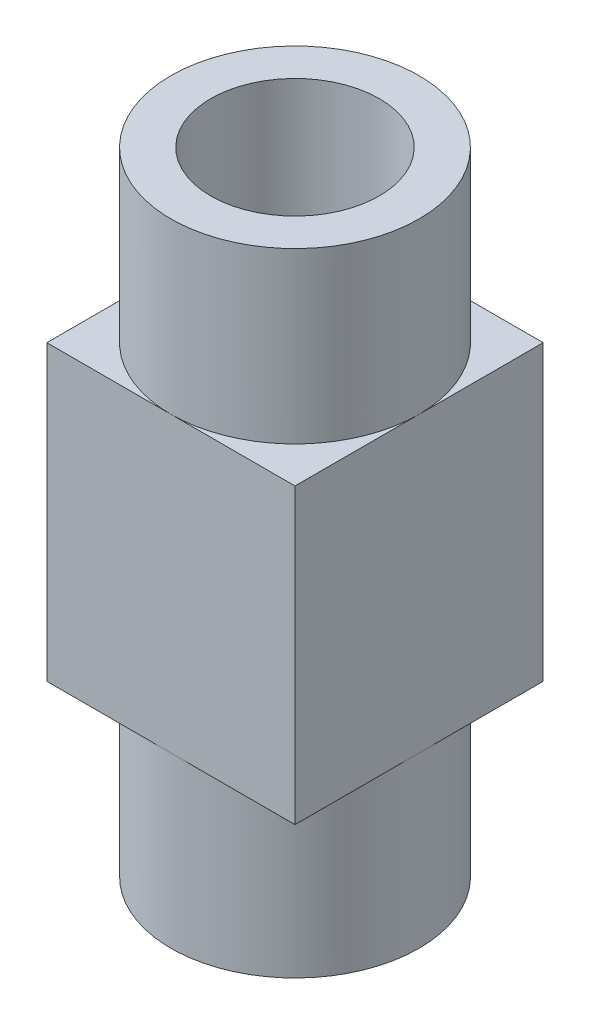
ISO-10303-21;
HEADER;
FILE_DESCRIPTION(('STEP AP214'),'2;1');
FILE_NAME('part.step','',(''),(''),'','','');
FILE_SCHEMA(('AUTOMOTIVE_DESIGN { 1 0 10303 214 1 1 1 1 }'));
ENDSEC;
DATA;
#1=APPLICATION_CONTEXT('core data for automotive mechanical design processes');
#2=APPLICATION_PROTOCOL_DEFINITION('international standard','automotive_design',2000,#1);
#3=PRODUCT_CONTEXT('',#1,'mechanical');
#4=PRODUCT('Part','Part','',(#3));
#5=PRODUCT_RELATED_PRODUCT_CATEGORY('part','',(#4));
#6=PRODUCT_DEFINITION_FORMATION('','',#4);
#7=PRODUCT_DEFINITION_CONTEXT('part definition',#1,'design');
#8=PRODUCT_DEFINITION('design','',#6,#7);
#9=PRODUCT_DEFINITION_SHAPE('','',#8);
#10=(LENGTH_UNIT() NAMED_UNIT(*) SI_UNIT(.MILLI.,.METRE.));
#11=(NAMED_UNIT(*) PLANE_ANGLE_UNIT() SI_UNIT($,.RADIAN.));
#12=(NAMED_UNIT(*) SI_UNIT($,.STERADIAN.) SOLID_ANGLE_UNIT());
#13=UNCERTAINTY_MEASURE_WITH_UNIT(LENGTH_MEASURE(1.E-05),#10,'distance_accuracy_value','');
#14=(GEOMETRIC_REPRESENTATION_CONTEXT(3) GLOBAL_UNCERTAINTY_ASSIGNED_CONTEXT((#13)) GLOBAL_UNIT_ASSIGNED_CONTEXT((#10,
#11,#12)) REPRESENTATION_CONTEXT('',''));
#15=CARTESIAN_POINT('',(0.,0.,0.));
#16=DIRECTION('',(0.,0.,1.));
#17=DIRECTION('',(1.,0.,0.));
#18=AXIS2_PLACEMENT_3D('',#15,#16,#17);
#19=CARTESIAN_POINT('',(-11.,41.,-11.));
#20=DIRECTION('',(0.,1.,0.));
#21=DIRECTION('',(0.,0.,1.));
#22=AXIS2_PLACEMENT_3D('',#19,#20,#21);
#23=PLANE('',#22);
#24=DIRECTION('',(0.,0.,-1.));
#25=VECTOR('',#24,1.);
#26=CARTESIAN_POINT('',(11.,41.,11.));
#27=LINE('',#26,#25);
#28=CARTESIAN_POINT('',(11.,41.,11.));
#29=VERTEX_POINT('',#28);
#30=CARTESIAN_POINT('',(11.,41.,0.));
#31=VERTEX_POINT('',#30);
#32=EDGE_CURVE('E140',#29,#31,#27,.T.);
#33=ORIENTED_EDGE('',*,*,#32,.T.);
#34=CARTESIAN_POINT('',(0.,41.,0.));
#35=DIRECTION('',(0.,-1.,0.));
#36=DIRECTION('',(1.,0.,0.));
#37=AXIS2_PLACEMENT_3D('',#34,#35,#36);
#38=CIRCLE('',#37,11.);
#39=CARTESIAN_POINT('',(0.,41.,11.));
#40=VERTEX_POINT('',#39);
#41=EDGE_CURVE('E76',#31,#40,#38,.T.);
#42=ORIENTED_EDGE('',*,*,#41,.T.);
#43=DIRECTION('',(1.,0.,0.));
#44=VECTOR('',#43,1.);
#45=CARTESIAN_POINT('',(-11.,41.,11.));
#46=LINE('',#45,#44);
#47=EDGE_CURVE('E137',#40,#29,#46,.T.);
#48=ORIENTED_EDGE('',*,*,#47,.T.);
#49=EDGE_LOOP('',(#33,#42,#48));
#50=FACE_BOUND('',#49,.T.);
#51=ADVANCED_FACE('F64',(#50),#23,.T.);
#52=CARTESIAN_POINT('',(-11.,41.,11.));
#53=VERTEX_POINT('',#52);
#54=EDGE_CURVE('E149',#53,#40,#46,.T.);
#55=ORIENTED_EDGE('',*,*,#54,.T.);
#56=CARTESIAN_POINT('',(-11.,41.,0.));
#57=VERTEX_POINT('',#56);
#58=EDGE_CURVE('E11',#40,#57,#38,.T.);
#59=ORIENTED_EDGE('',*,*,#58,.T.);
#60=DIRECTION('',(0.,0.,1.));
#61=VECTOR('',#60,1.);
#62=CARTESIAN_POINT('',(-11.,41.,-11.));
#63=LINE('',#62,#61);
#64=EDGE_CURVE('E154',#57,#53,#63,.T.);
#65=ORIENTED_EDGE('',*,*,#64,.T.);
#66=EDGE_LOOP('',(#55,#59,#65));
#67=FACE_BOUND('',#66,.T.);
#68=ADVANCED_FACE('F153',(#67),#23,.T.);
#69=CARTESIAN_POINT('',(-11.,41.,-11.));
#70=VERTEX_POINT('',#69);
#71=EDGE_CURVE('E151',#70,#57,#63,.T.);
#72=ORIENTED_EDGE('',*,*,#71,.T.);
#73=CARTESIAN_POINT('',(0.,41.,-11.));
#74=VERTEX_POINT('',#73);
#75=EDGE_CURVE('E74',#57,#74,#38,.T.);
#76=ORIENTED_EDGE('',*,*,#75,.T.);
#77=DIRECTION('',(-1.,0.,0.));
#78=VECTOR('',#77,1.);
#79=CARTESIAN_POINT('',(11.,41.,-11.));
#80=LINE('',#79,#78);
#81=EDGE_CURVE('E160',#74,#70,#80,.T.);
#82=ORIENTED_EDGE('',*,*,#81,.T.);
#83=EDGE_LOOP('',(#72,#76,#82));
#84=FACE_BOUND('',#83,.T.);
#85=ADVANCED_FACE('F217',(#84),#23,.T.);
#86=CARTESIAN_POINT('',(11.,41.,-11.));
#87=VERTEX_POINT('',#86);
#88=EDGE_CURVE('E161',#87,#74,#80,.T.);
#89=ORIENTED_EDGE('',*,*,#88,.T.);
#90=EDGE_CURVE('E144',#74,#31,#38,.T.);
#91=ORIENTED_EDGE('',*,*,#90,.T.);
#92=EDGE_CURVE('E156',#31,#87,#27,.T.);
#93=ORIENTED_EDGE('',*,*,#92,.T.);
#94=EDGE_LOOP('',(#89,#91,#93));
#95=FACE_BOUND('',#94,.T.);
#96=ADVANCED_FACE('F209',(#95),#23,.T.);
#97=CARTESIAN_POINT('',(0.,15.,0.));
#98=DIRECTION('',(0.,-1.,0.));
#99=DIRECTION('',(0.,0.,-1.));
#100=AXIS2_PLACEMENT_3D('',#97,#98,#99);
#101=CYLINDRICAL_SURFACE('',#100,11.);
#102=CARTESIAN_POINT('',(0.,15.,0.));
#103=DIRECTION('',(0.,-1.,0.));
#104=DIRECTION('',(1.,0.,0.));
#105=AXIS2_PLACEMENT_3D('',#102,#103,#104);
#106=CIRCLE('',#105,11.);
#107=CARTESIAN_POINT('',(11.,15.,0.));
#108=VERTEX_POINT('',#107);
#109=CARTESIAN_POINT('',(0.,15.,11.));
#110=VERTEX_POINT('',#109);
#111=EDGE_CURVE('E190',#108,#110,#106,.T.);
#112=ORIENTED_EDGE('',*,*,#111,.T.);
#113=CARTESIAN_POINT('',(-11.,15.,0.));
#114=VERTEX_POINT('',#113);
#115=EDGE_CURVE('E192',#110,#114,#106,.T.);
#116=ORIENTED_EDGE('',*,*,#115,.T.);
#117=CARTESIAN_POINT('',(0.,15.,-11.));
#118=VERTEX_POINT('',#117);
#119=EDGE_CURVE('E199',#114,#118,#106,.T.);
#120=ORIENTED_EDGE('',*,*,#119,.T.);
#121=EDGE_CURVE('E193',#118,#108,#106,.T.);
#122=ORIENTED_EDGE('',*,*,#121,.T.);
#123=EDGE_LOOP('',(#112,#116,#120,#122));
#124=FACE_BOUND('',#123,.T.);
#125=CARTESIAN_POINT('',(0.,0.,0.));
#126=DIRECTION('',(0.,-1.,0.));
#127=DIRECTION('',(1.,0.,0.));
#128=AXIS2_PLACEMENT_3D('',#125,#126,#127);
#129=CIRCLE('',#128,11.);
#130=CARTESIAN_POINT('',(11.,0.,0.));
#131=VERTEX_POINT('',#130);
#132=EDGE_CURVE('E68',#131,#131,#129,.T.);
#133=ORIENTED_EDGE('',*,*,#132,.F.);
#134=EDGE_LOOP('',(#133));
#135=FACE_BOUND('',#134,.T.);
#136=ADVANCED_FACE('F66',(#124,#135),#101,.T.);
#137=CARTESIAN_POINT('',(0.,0.,0.));
#138=DIRECTION('',(0.,-1.,0.));
#139=DIRECTION('',(0.,0.,-1.));
#140=AXIS2_PLACEMENT_3D('',#137,#138,#139);
#141=PLANE('',#140);
#142=CARTESIAN_POINT('',(0.,0.,0.));
#143=DIRECTION('',(0.,1.,0.));
#144=DIRECTION('',(0.,0.,-1.));
#145=AXIS2_PLACEMENT_3D('',#142,#143,#144);
#146=CIRCLE('',#145,7.475);
#147=CARTESIAN_POINT('',(0.,0.,-7.475));
#148=VERTEX_POINT('',#147);
#149=EDGE_CURVE('E281',#148,#148,#146,.T.);
#150=ORIENTED_EDGE('',*,*,#149,.T.);
#151=EDGE_LOOP('',(#150));
#152=FACE_BOUND('',#151,.T.);
#153=ORIENTED_EDGE('',*,*,#132,.T.);
#154=EDGE_LOOP('',(#153));
#155=FACE_BOUND('',#154,.T.);
#156=ADVANCED_FACE('F206',(#152,#155),#141,.T.);
#157=CARTESIAN_POINT('',(-11.,15.,-11.));
#158=DIRECTION('',(0.,1.,0.));
#159=DIRECTION('',(0.,0.,1.));
#160=AXIS2_PLACEMENT_3D('',#157,#158,#159);
#161=PLANE('',#160);
#162=ORIENTED_EDGE('',*,*,#111,.F.);
#163=DIRECTION('',(0.,0.,-1.));
#164=VECTOR('',#163,1.);
#165=CARTESIAN_POINT('',(11.,15.,0.));
#166=LINE('',#165,#164);
#167=CARTESIAN_POINT('',(11.,15.,11.));
#168=VERTEX_POINT('',#167);
#169=EDGE_CURVE('E90',#168,#108,#166,.T.);
#170=ORIENTED_EDGE('',*,*,#169,.F.);
#171=DIRECTION('',(1.,0.,0.));
#172=VECTOR('',#171,1.);
#173=CARTESIAN_POINT('',(0.,15.,11.));
#174=LINE('',#173,#172);
#175=EDGE_CURVE('E169',#110,#168,#174,.T.);
#176=ORIENTED_EDGE('',*,*,#175,.F.);
#177=EDGE_LOOP('',(#162,#170,#176));
#178=FACE_BOUND('',#177,.T.);
#179=ADVANCED_FACE('F214',(#178),#161,.F.);
#180=ORIENTED_EDGE('',*,*,#115,.F.);
#181=CARTESIAN_POINT('',(-11.,15.,11.));
#182=VERTEX_POINT('',#181);
#183=EDGE_CURVE('E171',#182,#110,#174,.T.);
#184=ORIENTED_EDGE('',*,*,#183,.F.);
#185=DIRECTION('',(0.,0.,1.));
#186=VECTOR('',#185,1.);
#187=CARTESIAN_POINT('',(-11.,15.,0.));
#188=LINE('',#187,#186);
#189=EDGE_CURVE('E170',#114,#182,#188,.T.);
#190=ORIENTED_EDGE('',*,*,#189,.F.);
#191=EDGE_LOOP('',(#180,#184,#190));
#192=FACE_BOUND('',#191,.T.);
#193=ADVANCED_FACE('F247',(#192),#161,.F.);
#194=ORIENTED_EDGE('',*,*,#119,.F.);
#195=CARTESIAN_POINT('',(-11.,15.,-11.));
#196=VERTEX_POINT('',#195);
#197=EDGE_CURVE('E165',#196,#114,#188,.T.);
#198=ORIENTED_EDGE('',*,*,#197,.F.);
#199=DIRECTION('',(-1.,0.,0.));
#200=VECTOR('',#199,1.);
#201=CARTESIAN_POINT('',(11.,15.,-11.));
#202=LINE('',#201,#200);
#203=EDGE_CURVE('E178',#118,#196,#202,.T.);
#204=ORIENTED_EDGE('',*,*,#203,.F.);
#205=EDGE_LOOP('',(#194,#198,#204));
#206=FACE_BOUND('',#205,.T.);
#207=ADVANCED_FACE('F232',(#206),#161,.F.);
#208=CARTESIAN_POINT('',(-11.,41.,0.));
#209=DIRECTION('',(1.,0.,0.));
#210=DIRECTION('',(0.,0.,-1.));
#211=AXIS2_PLACEMENT_3D('',#208,#209,#210);
#212=PLANE('',#211);
#213=ORIENTED_EDGE('',*,*,#197,.T.);
#214=ORIENTED_EDGE('',*,*,#189,.T.);
#215=DIRECTION('',(0.,-1.,0.));
#216=VECTOR('',#215,1.);
#217=CARTESIAN_POINT('',(-11.,41.,11.));
#218=LINE('',#217,#216);
#219=EDGE_CURVE('E186',#53,#182,#218,.T.);
#220=ORIENTED_EDGE('',*,*,#219,.F.);
#221=ORIENTED_EDGE('',*,*,#64,.F.);
#222=ORIENTED_EDGE('',*,*,#71,.F.);
#223=DIRECTION('',(0.,-1.,0.));
#224=VECTOR('',#223,1.);
#225=CARTESIAN_POINT('',(-11.,41.,-11.));
#226=LINE('',#225,#224);
#227=EDGE_CURVE('E188',#70,#196,#226,.T.);
#228=ORIENTED_EDGE('',*,*,#227,.T.);
#229=EDGE_LOOP('',(#213,#214,#220,#221,#222,#228));
#230=FACE_BOUND('',#229,.T.);
#231=ADVANCED_FACE('F241',(#230),#212,.F.);
#232=CARTESIAN_POINT('',(0.,41.,11.));
#233=DIRECTION('',(0.,0.,-1.));
#234=DIRECTION('',(-1.,0.,0.));
#235=AXIS2_PLACEMENT_3D('',#232,#233,#234);
#236=PLANE('',#235);
#237=ORIENTED_EDGE('',*,*,#175,.T.);
#238=DIRECTION('',(0.,-1.,0.));
#239=VECTOR('',#238,1.);
#240=CARTESIAN_POINT('',(11.,41.,11.));
#241=LINE('',#240,#239);
#242=EDGE_CURVE('E150',#29,#168,#241,.T.);
#243=ORIENTED_EDGE('',*,*,#242,.F.);
#244=ORIENTED_EDGE('',*,*,#47,.F.);
#245=ORIENTED_EDGE('',*,*,#54,.F.);
#246=ORIENTED_EDGE('',*,*,#219,.T.);
#247=ORIENTED_EDGE('',*,*,#183,.T.);
#248=EDGE_LOOP('',(#237,#243,#244,#245,#246,#247));
#249=FACE_BOUND('',#248,.T.);
#250=ADVANCED_FACE('F148',(#249),#236,.F.);
#251=CARTESIAN_POINT('',(11.,41.,0.));
#252=DIRECTION('',(-1.,0.,0.));
#253=DIRECTION('',(0.,0.,1.));
#254=AXIS2_PLACEMENT_3D('',#251,#252,#253);
#255=PLANE('',#254);
#256=ORIENTED_EDGE('',*,*,#169,.T.);
#257=CARTESIAN_POINT('',(11.,15.,-11.));
#258=VERTEX_POINT('',#257);
#259=EDGE_CURVE('E175',#108,#258,#166,.T.);
#260=ORIENTED_EDGE('',*,*,#259,.T.);
#261=DIRECTION('',(0.,-1.,0.));
#262=VECTOR('',#261,1.);
#263=CARTESIAN_POINT('',(11.,41.,-11.));
#264=LINE('',#263,#262);
#265=EDGE_CURVE('E164',#87,#258,#264,.T.);
#266=ORIENTED_EDGE('',*,*,#265,.F.);
#267=ORIENTED_EDGE('',*,*,#92,.F.);
#268=ORIENTED_EDGE('',*,*,#32,.F.);
#269=ORIENTED_EDGE('',*,*,#242,.T.);
#270=EDGE_LOOP('',(#256,#260,#266,#267,#268,#269));
#271=FACE_BOUND('',#270,.T.);
#272=ADVANCED_FACE('F235',(#271),#255,.F.);
#273=CARTESIAN_POINT('',(11.,41.,-11.));
#274=DIRECTION('',(0.,0.,1.));
#275=DIRECTION('',(1.,0.,0.));
#276=AXIS2_PLACEMENT_3D('',#273,#274,#275);
#277=PLANE('',#276);
#278=EDGE_CURVE('E179',#258,#118,#202,.T.);
#279=ORIENTED_EDGE('',*,*,#278,.T.);
#280=ORIENTED_EDGE('',*,*,#203,.T.);
#281=ORIENTED_EDGE('',*,*,#227,.F.);
#282=ORIENTED_EDGE('',*,*,#81,.F.);
#283=ORIENTED_EDGE('',*,*,#88,.F.);
#284=ORIENTED_EDGE('',*,*,#265,.T.);
#285=EDGE_LOOP('',(#279,#280,#281,#282,#283,#284));
#286=FACE_BOUND('',#285,.T.);
#287=ADVANCED_FACE('F230',(#286),#277,.F.);
#288=ORIENTED_EDGE('',*,*,#121,.F.);
#289=ORIENTED_EDGE('',*,*,#278,.F.);
#290=ORIENTED_EDGE('',*,*,#259,.F.);
#291=EDGE_LOOP('',(#288,#289,#290));
#292=FACE_BOUND('',#291,.T.);
#293=ADVANCED_FACE('F227',(#292),#161,.F.);
#294=CARTESIAN_POINT('',(0.,56.,0.));
#295=DIRECTION('',(0.,-1.,0.));
#296=DIRECTION('',(0.,0.,-1.));
#297=AXIS2_PLACEMENT_3D('',#294,#295,#296);
#298=CYLINDRICAL_SURFACE('',#297,11.);
#299=CARTESIAN_POINT('',(0.,56.,0.));
#300=DIRECTION('',(0.,-1.,0.));
#301=DIRECTION('',(-1.,0.,0.));
#302=AXIS2_PLACEMENT_3D('',#299,#300,#301);
#303=CIRCLE('',#302,11.);
#304=CARTESIAN_POINT('',(-11.,56.,0.));
#305=VERTEX_POINT('',#304);
#306=EDGE_CURVE('E142',#305,#305,#303,.T.);
#307=ORIENTED_EDGE('',*,*,#306,.T.);
#308=EDGE_LOOP('',(#307));
#309=FACE_BOUND('',#308,.T.);
#310=ORIENTED_EDGE('',*,*,#41,.F.);
#311=ORIENTED_EDGE('',*,*,#90,.F.);
#312=ORIENTED_EDGE('',*,*,#75,.F.);
#313=ORIENTED_EDGE('',*,*,#58,.F.);
#314=EDGE_LOOP('',(#310,#311,#312,#313));
#315=FACE_BOUND('',#314,.T.);
#316=ADVANCED_FACE('F129',(#309,#315),#298,.T.);
#317=CARTESIAN_POINT('',(0.,56.,0.));
#318=DIRECTION('',(0.,-1.,0.));
#319=DIRECTION('',(0.,0.,-1.));
#320=AXIS2_PLACEMENT_3D('',#317,#318,#319);
#321=PLANE('',#320);
#322=CARTESIAN_POINT('',(0.,56.,0.));
#323=DIRECTION('',(0.,-1.,0.));
#324=DIRECTION('',(0.,0.,1.));
#325=AXIS2_PLACEMENT_3D('',#322,#323,#324);
#326=CIRCLE('',#325,7.475);
#327=CARTESIAN_POINT('',(0.,56.,7.475));
#328=VERTEX_POINT('',#327);
#329=EDGE_CURVE('E287',#328,#328,#326,.T.);
#330=ORIENTED_EDGE('',*,*,#329,.T.);
#331=EDGE_LOOP('',(#330));
#332=FACE_BOUND('',#331,.T.);
#333=ORIENTED_EDGE('',*,*,#306,.F.);
#334=EDGE_LOOP('',(#333));
#335=FACE_BOUND('',#334,.T.);
#336=ADVANCED_FACE('F291',(#332,#335),#321,.F.);
#337=CARTESIAN_POINT('',(0.,15.,0.));
#338=DIRECTION('',(0.,1.,0.));
#339=DIRECTION('',(0.,0.,1.));
#340=AXIS2_PLACEMENT_3D('',#337,#338,#339);
#341=PLANE('',#340);
#342=CARTESIAN_POINT('',(0.,15.,0.));
#343=DIRECTION('',(0.,-1.,0.));
#344=DIRECTION('',(0.,0.,-1.));
#345=AXIS2_PLACEMENT_3D('',#342,#343,#344);
#346=CIRCLE('',#345,7.475);
#347=CARTESIAN_POINT('',(0.,15.,-7.475));
#348=VERTEX_POINT('',#347);
#349=EDGE_CURVE('E143',#348,#348,#346,.T.);
#350=ORIENTED_EDGE('',*,*,#349,.T.);
#351=EDGE_LOOP('',(#350));
#352=FACE_BOUND('',#351,.T.);
#353=ADVANCED_FACE('F307',(#352),#341,.F.);
#354=CARTESIAN_POINT('',(0.,0.,0.));
#355=DIRECTION('',(0.,1.,0.));
#356=DIRECTION('',(0.,0.,-1.));
#357=AXIS2_PLACEMENT_3D('',#354,#355,#356);
#358=CYLINDRICAL_SURFACE('',#357,7.475);
#359=ORIENTED_EDGE('',*,*,#349,.F.);
#360=EDGE_LOOP('',(#359));
#361=FACE_BOUND('',#360,.T.);
#362=ORIENTED_EDGE('',*,*,#149,.F.);
#363=EDGE_LOOP('',(#362));
#364=FACE_BOUND('',#363,.T.);
#365=ADVANCED_FACE('F302',(#361,#364),#358,.F.);
#366=CARTESIAN_POINT('',(0.,41.,0.));
#367=DIRECTION('',(0.,-1.,0.));
#368=DIRECTION('',(0.,0.,-1.));
#369=AXIS2_PLACEMENT_3D('',#366,#367,#368);
#370=PLANE('',#369);
#371=CARTESIAN_POINT('',(0.,41.,0.));
#372=DIRECTION('',(0.,1.,0.));
#373=DIRECTION('',(0.,0.,1.));
#374=AXIS2_PLACEMENT_3D('',#371,#372,#373);
#375=CIRCLE('',#374,7.475);
#376=CARTESIAN_POINT('',(0.,41.,7.475));
#377=VERTEX_POINT('',#376);
#378=EDGE_CURVE('E284',#377,#377,#375,.T.);
#379=ORIENTED_EDGE('',*,*,#378,.T.);
#380=EDGE_LOOP('',(#379));
#381=FACE_BOUND('',#380,.T.);
#382=ADVANCED_FACE('F296',(#381),#370,.F.);
#383=CARTESIAN_POINT('',(0.,56.,0.));
#384=DIRECTION('',(0.,-1.,0.));
#385=DIRECTION('',(0.,0.,1.));
#386=AXIS2_PLACEMENT_3D('',#383,#384,#385);
#387=CYLINDRICAL_SURFACE('',#386,7.475);
#388=ORIENTED_EDGE('',*,*,#378,.F.);
#389=EDGE_LOOP('',(#388));
#390=FACE_BOUND('',#389,.T.);
#391=ORIENTED_EDGE('',*,*,#329,.F.);
#392=EDGE_LOOP('',(#391));
#393=FACE_BOUND('',#392,.T.);
#394=ADVANCED_FACE('F294',(#390,#393),#387,.F.);
#395=CLOSED_SHELL('',(#51,#68,#85,#96,#136,#156,#179,#193,#207,#231,#250,#272,#287,#293,#316,
#336,#353,#365,#382,#394));
#396=MANIFOLD_SOLID_BREP('B2',#395);
#397=ADVANCED_BREP_SHAPE_REPRESENTATION('',(#18,#396),#14);
#398=SHAPE_DEFINITION_REPRESENTATION(#9,#397);
ENDSEC;
END-ISO-10303-21;
